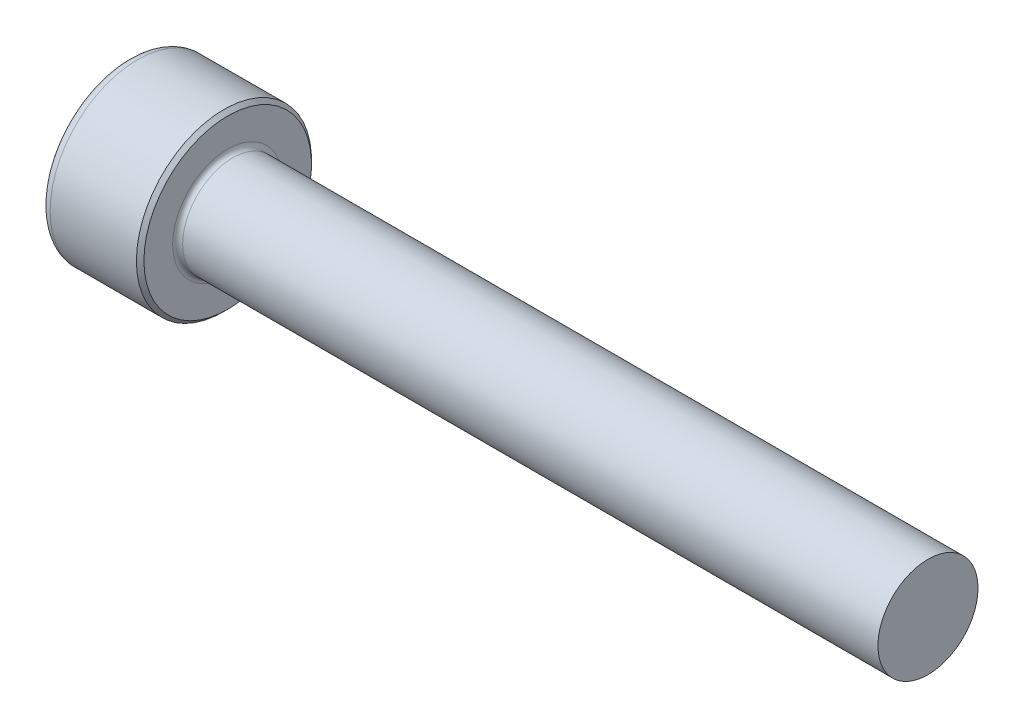
ISO-10303-21;
HEADER;
FILE_DESCRIPTION(('STEP AP214'),'2;1');
FILE_NAME('part.step','',(''),(''),'','','');
FILE_SCHEMA(('AUTOMOTIVE_DESIGN { 1 0 10303 214 1 1 1 1 }'));
ENDSEC;
DATA;
#1=APPLICATION_CONTEXT('core data for automotive mechanical design processes');
#2=APPLICATION_PROTOCOL_DEFINITION('international standard','automotive_design',2000,#1);
#3=PRODUCT_CONTEXT('',#1,'mechanical');
#4=PRODUCT('Part','Part','',(#3));
#5=PRODUCT_RELATED_PRODUCT_CATEGORY('part','',(#4));
#6=PRODUCT_DEFINITION_FORMATION('','',#4);
#7=PRODUCT_DEFINITION_CONTEXT('part definition',#1,'design');
#8=PRODUCT_DEFINITION('design','',#6,#7);
#9=PRODUCT_DEFINITION_SHAPE('','',#8);
#10=(LENGTH_UNIT() NAMED_UNIT(*) SI_UNIT(.MILLI.,.METRE.));
#11=(NAMED_UNIT(*) PLANE_ANGLE_UNIT() SI_UNIT($,.RADIAN.));
#12=(NAMED_UNIT(*) SI_UNIT($,.STERADIAN.) SOLID_ANGLE_UNIT());
#13=UNCERTAINTY_MEASURE_WITH_UNIT(LENGTH_MEASURE(1.E-05),#10,'distance_accuracy_value','');
#14=(GEOMETRIC_REPRESENTATION_CONTEXT(3) GLOBAL_UNCERTAINTY_ASSIGNED_CONTEXT((#13)) GLOBAL_UNIT_ASSIGNED_CONTEXT((#10,
#11,#12)) REPRESENTATION_CONTEXT('',''));
#15=CARTESIAN_POINT('',(0.,0.,0.));
#16=DIRECTION('',(0.,0.,1.));
#17=DIRECTION('',(1.,0.,0.));
#18=AXIS2_PLACEMENT_3D('',#15,#16,#17);
#19=CARTESIAN_POINT('',(0.,0.,0.));
#20=DIRECTION('',(-1.,0.,0.));
#21=DIRECTION('',(0.,0.,1.));
#22=AXIS2_PLACEMENT_3D('',#19,#20,#21);
#23=CYLINDRICAL_SURFACE('',#22,2.);
#24=CARTESIAN_POINT('',(4.2,0.,0.));
#25=DIRECTION('',(-1.,0.,0.));
#26=DIRECTION('',(0.,0.,1.));
#27=AXIS2_PLACEMENT_3D('',#24,#25,#26);
#28=CIRCLE('',#27,2.);
#29=CARTESIAN_POINT('',(4.2,0.,2.));
#30=VERTEX_POINT('',#29);
#31=EDGE_CURVE('E204',#30,#30,#28,.T.);
#32=ORIENTED_EDGE('',*,*,#31,.F.);
#33=EDGE_LOOP('',(#32));
#34=FACE_BOUND('',#33,.T.);
#35=CARTESIAN_POINT('',(32.,0.,0.));
#36=DIRECTION('',(1.,0.,0.));
#37=DIRECTION('',(0.,0.,-1.));
#38=AXIS2_PLACEMENT_3D('',#35,#36,#37);
#39=CIRCLE('',#38,2.);
#40=CARTESIAN_POINT('',(32.,0.,-2.));
#41=VERTEX_POINT('',#40);
#42=EDGE_CURVE('E111',#41,#41,#39,.T.);
#43=ORIENTED_EDGE('',*,*,#42,.F.);
#44=EDGE_LOOP('',(#43));
#45=FACE_BOUND('',#44,.T.);
#46=ADVANCED_FACE('F44',(#34,#45),#23,.T.);
#47=CARTESIAN_POINT('',(0.,0.,0.));
#48=DIRECTION('',(1.,0.,0.));
#49=DIRECTION('',(0.,0.,-1.));
#50=AXIS2_PLACEMENT_3D('',#47,#48,#49);
#51=PLANE('',#50);
#52=CARTESIAN_POINT('',(0.,0.,0.));
#53=DIRECTION('',(1.,0.,0.));
#54=DIRECTION('',(0.,0.,-1.));
#55=AXIS2_PLACEMENT_3D('',#52,#53,#54);
#56=CIRCLE('',#55,3.1);
#57=CARTESIAN_POINT('',(0.,0.,-3.1));
#58=VERTEX_POINT('',#57);
#59=EDGE_CURVE('E219',#58,#58,#56,.F.);
#60=ORIENTED_EDGE('',*,*,#59,.T.);
#61=EDGE_LOOP('',(#60));
#62=FACE_BOUND('',#61,.T.);
#63=CARTESIAN_POINT('',(0.,0.,0.));
#64=DIRECTION('',(-1.,0.,0.));
#65=DIRECTION('',(0.,0.,1.));
#66=AXIS2_PLACEMENT_3D('',#63,#64,#65);
#67=CIRCLE('',#66,1.72);
#68=CARTESIAN_POINT('',(0.,0.,-1.72));
#69=VERTEX_POINT('',#68);
#70=CARTESIAN_POINT('',(0.,-1.48956369450923,-0.859999999999999));
#71=VERTEX_POINT('',#70);
#72=EDGE_CURVE('E71',#69,#71,#67,.T.);
#73=ORIENTED_EDGE('',*,*,#72,.F.);
#74=CARTESIAN_POINT('',(0.,1.48956369450923,-0.86));
#75=VERTEX_POINT('',#74);
#76=EDGE_CURVE('E145',#75,#69,#67,.T.);
#77=ORIENTED_EDGE('',*,*,#76,.F.);
#78=CARTESIAN_POINT('',(0.,1.48956369450924,0.859999999999998));
#79=VERTEX_POINT('',#78);
#80=EDGE_CURVE('E140',#79,#75,#67,.T.);
#81=ORIENTED_EDGE('',*,*,#80,.F.);
#82=CARTESIAN_POINT('',(0.,0.,1.72));
#83=VERTEX_POINT('',#82);
#84=EDGE_CURVE('E113',#83,#79,#67,.T.);
#85=ORIENTED_EDGE('',*,*,#84,.F.);
#86=CARTESIAN_POINT('',(0.,-1.48956369450923,0.860000000000001));
#87=VERTEX_POINT('',#86);
#88=EDGE_CURVE('E103',#87,#83,#67,.T.);
#89=ORIENTED_EDGE('',*,*,#88,.F.);
#90=EDGE_CURVE('E64',#71,#87,#67,.T.);
#91=ORIENTED_EDGE('',*,*,#90,.F.);
#92=EDGE_LOOP('',(#73,#77,#81,#85,#89,#91));
#93=FACE_BOUND('',#92,.T.);
#94=ADVANCED_FACE('F138',(#62,#93),#51,.F.);
#95=CARTESIAN_POINT('',(0.,0.,0.));
#96=DIRECTION('',(-1.,0.,0.));
#97=DIRECTION('',(0.,0.,1.));
#98=AXIS2_PLACEMENT_3D('',#95,#96,#97);
#99=CYLINDRICAL_SURFACE('',#98,3.5);
#100=CARTESIAN_POINT('',(3.85,0.,0.));
#101=DIRECTION('',(-1.,0.,0.));
#102=DIRECTION('',(0.,0.,1.));
#103=AXIS2_PLACEMENT_3D('',#100,#101,#102);
#104=CIRCLE('',#103,3.5);
#105=CARTESIAN_POINT('',(3.85,0.,3.5));
#106=VERTEX_POINT('',#105);
#107=EDGE_CURVE('E225',#106,#106,#104,.T.);
#108=ORIENTED_EDGE('',*,*,#107,.T.);
#109=EDGE_LOOP('',(#108));
#110=FACE_BOUND('',#109,.T.);
#111=CARTESIAN_POINT('',(0.4,0.,0.));
#112=DIRECTION('',(1.,0.,0.));
#113=DIRECTION('',(0.,0.,-1.));
#114=AXIS2_PLACEMENT_3D('',#111,#112,#113);
#115=CIRCLE('',#114,3.5);
#116=CARTESIAN_POINT('',(0.4,0.,-3.5));
#117=VERTEX_POINT('',#116);
#118=EDGE_CURVE('E222',#117,#117,#115,.T.);
#119=ORIENTED_EDGE('',*,*,#118,.T.);
#120=EDGE_LOOP('',(#119));
#121=FACE_BOUND('',#120,.T.);
#122=ADVANCED_FACE('F238',(#110,#121),#99,.T.);
#123=CARTESIAN_POINT('',(4.,3.5,0.));
#124=DIRECTION('',(-1.,0.,0.));
#125=DIRECTION('',(0.,0.,1.));
#126=AXIS2_PLACEMENT_3D('',#123,#124,#125);
#127=PLANE('',#126);
#128=CARTESIAN_POINT('',(4.,0.,0.));
#129=DIRECTION('',(-1.,0.,0.));
#130=DIRECTION('',(0.,0.,1.));
#131=AXIS2_PLACEMENT_3D('',#128,#129,#130);
#132=CIRCLE('',#131,3.35);
#133=CARTESIAN_POINT('',(4.,0.,3.35));
#134=VERTEX_POINT('',#133);
#135=EDGE_CURVE('E58',#134,#134,#132,.F.);
#136=ORIENTED_EDGE('',*,*,#135,.T.);
#137=EDGE_LOOP('',(#136));
#138=FACE_BOUND('',#137,.T.);
#139=CARTESIAN_POINT('',(4.,0.,0.));
#140=DIRECTION('',(-1.,0.,0.));
#141=DIRECTION('',(0.,0.,1.));
#142=AXIS2_PLACEMENT_3D('',#139,#140,#141);
#143=CIRCLE('',#142,2.2);
#144=CARTESIAN_POINT('',(4.,0.,2.2));
#145=VERTEX_POINT('',#144);
#146=EDGE_CURVE('E216',#145,#145,#143,.T.);
#147=ORIENTED_EDGE('',*,*,#146,.T.);
#148=EDGE_LOOP('',(#147));
#149=FACE_BOUND('',#148,.T.);
#150=ADVANCED_FACE('F230',(#138,#149),#127,.F.);
#151=CARTESIAN_POINT('',(4.2,0.,0.));
#152=DIRECTION('',(-1.,0.,0.));
#153=DIRECTION('',(0.,0.,1.));
#154=AXIS2_PLACEMENT_3D('',#151,#152,#153);
#155=TOROIDAL_SURFACE('',#154,2.2,0.2);
#156=ORIENTED_EDGE('',*,*,#146,.F.);
#157=EDGE_LOOP('',(#156));
#158=FACE_BOUND('',#157,.T.);
#159=ORIENTED_EDGE('',*,*,#31,.T.);
#160=EDGE_LOOP('',(#159));
#161=FACE_BOUND('',#160,.T.);
#162=ADVANCED_FACE('F246',(#158,#161),#155,.F.);
#163=CARTESIAN_POINT('',(0.4,0.,0.));
#164=DIRECTION('',(1.,0.,0.));
#165=DIRECTION('',(0.,0.,-1.));
#166=AXIS2_PLACEMENT_3D('',#163,#164,#165);
#167=TOROIDAL_SURFACE('',#166,3.1,0.4);
#168=ORIENTED_EDGE('',*,*,#118,.F.);
#169=EDGE_LOOP('',(#168));
#170=FACE_BOUND('',#169,.T.);
#171=ORIENTED_EDGE('',*,*,#59,.F.);
#172=EDGE_LOOP('',(#171));
#173=FACE_BOUND('',#172,.T.);
#174=ADVANCED_FACE('F235',(#170,#173),#167,.T.);
#175=CARTESIAN_POINT('',(3.85,0.,0.));
#176=DIRECTION('',(-1.,0.,0.));
#177=DIRECTION('',(0.,0.,1.));
#178=AXIS2_PLACEMENT_3D('',#175,#176,#177);
#179=CONICAL_SURFACE('',#178,3.5,0.785398163397455);
#180=ORIENTED_EDGE('',*,*,#135,.F.);
#181=EDGE_LOOP('',(#180));
#182=FACE_BOUND('',#181,.T.);
#183=ORIENTED_EDGE('',*,*,#107,.F.);
#184=EDGE_LOOP('',(#183));
#185=FACE_BOUND('',#184,.T.);
#186=ADVANCED_FACE('F46',(#182,#185),#179,.T.);
#187=CARTESIAN_POINT('',(0.,0.,0.));
#188=DIRECTION('',(-1.,0.,0.));
#189=DIRECTION('',(0.,0.,1.));
#190=AXIS2_PLACEMENT_3D('',#187,#188,#189);
#191=CONICAL_SURFACE('',#190,1.72,1.0471975511966);
#192=ORIENTED_EDGE('',*,*,#84,.T.);
#193=CARTESIAN_POINT('',(-6.66733795908039E-05,-0.000199999999999748,1.72011547005384));
#194=CARTESIAN_POINT('',(0.0217642282774095,0.0652606786833884,1.68232172959465));
#195=CARTESIAN_POINT('',(0.0416191270638703,0.131286405547804,1.64420175841604));
#196=CARTESIAN_POINT('',(0.0762771760190284,0.264481325669599,1.56730163542903));
#197=CARTESIAN_POINT('',(0.0910680635017844,0.331652886810751,1.5285201165223));
#198=CARTESIAN_POINT('',(0.114093772405454,0.465163484222722,1.45143773716683));
#199=CARTESIAN_POINT('',(0.122481816019068,0.531481970186887,1.41314874144317));
#200=CARTESIAN_POINT('',(0.132498056760639,0.664431226407797,1.33639045257547));
#201=CARTESIAN_POINT('',(0.13413454538366,0.731061512956971,1.29792143870012));
#202=CARTESIAN_POINT('',(0.130742415424505,0.855579416187288,1.22603099375117));
#203=CARTESIAN_POINT('',(0.126546683530354,0.913485608573299,1.19259883798936));
#204=CARTESIAN_POINT('',(0.113244842751698,1.02892070857717,1.12595235192819));
#205=CARTESIAN_POINT('',(0.104134183519144,1.08644921649049,1.09273825239836));
#206=CARTESIAN_POINT('',(0.0813567321989698,1.20212260425817,1.02595419083261));
#207=CARTESIAN_POINT('',(0.0675933218337276,1.26025283284703,0.992392687708781));
#208=CARTESIAN_POINT('',(0.036355214015323,1.37564595205978,0.925770439268665));
#209=CARTESIAN_POINT('',(0.0188878634218886,1.43291032272483,0.892708839450225));
#210=CARTESIAN_POINT('',(-6.66733795909694E-05,1.48976369450923,0.859884529946161));
#211=B_SPLINE_CURVE_WITH_KNOTS('',3,(#193,#194,#195,#196,#197,#198,#199,#200,#201,#202,#203,
#204,#205,#206,#207,#208,#209,#210),.UNSPECIFIED.,.F.,.F.,(4,2,2,2,2,2,2,2,4),(0.,
0.236123584216744,0.472814971763925,0.70364743867324,0.934196338755068,1.13499258844024,
1.33597505955949,1.54141751288895,1.74645621521931),.UNSPECIFIED.);
#212=EDGE_CURVE('E11',#83,#79,#211,.T.);
#213=ORIENTED_EDGE('',*,*,#212,.F.);
#214=EDGE_LOOP('',(#192,#213));
#215=FACE_BOUND('',#214,.T.);
#216=ADVANCED_FACE('F116',(#215),#191,.F.);
#217=ORIENTED_EDGE('',*,*,#80,.T.);
#218=CARTESIAN_POINT('',(-0.553872346443666,1.48956369450923,-2.22711389091029));
#219=CARTESIAN_POINT('',(-0.523011837033895,1.48956369450923,-2.16278931232635));
#220=CARTESIAN_POINT('',(-0.492471948370039,1.48956369450923,-2.09830816259722));
#221=CARTESIAN_POINT('',(-0.432215091527907,1.48956369450923,-1.9689489379535));
#222=CARTESIAN_POINT('',(-0.402498271447276,1.48956369450923,-1.90407079413769));
#223=CARTESIAN_POINT('',(-0.343903216609206,1.48956369450923,-1.77346180510982));
#224=CARTESIAN_POINT('',(-0.315031162223555,1.48956369450923,-1.70772817468804));
#225=CARTESIAN_POINT('',(-0.258582383686243,1.48956369450923,-1.57571038900732));
#226=CARTESIAN_POINT('',(-0.231005592183019,1.48956369450923,-1.50942626258466));
#227=CARTESIAN_POINT('',(-0.176786917007244,1.48956369450923,-1.3744512033089));
#228=CARTESIAN_POINT('',(-0.150188317148423,1.48956369450923,-1.30574264939369));
#229=CARTESIAN_POINT('',(-0.0992114690057399,1.48956369450923,-1.16750939875529));
#230=CARTESIAN_POINT('',(-0.0748334989467716,1.48956369450923,-1.09798460099264));
#231=CARTESIAN_POINT('',(-0.00605863684124883,1.48956369450923,-0.888298955989035));
#232=CARTESIAN_POINT('',(0.0341405436403476,1.48956369450923,-0.746643132602322));
#233=CARTESIAN_POINT('',(0.0807696169748476,1.48956369450923,-0.53132508624346));
#234=CARTESIAN_POINT('',(0.0940283380684503,1.48956369450923,-0.459148714174868));
#235=CARTESIAN_POINT('',(0.115080292133262,1.48956369450923,-0.313984049201615));
#236=CARTESIAN_POINT('',(0.122873894447601,1.48956369450923,-0.240995811503114));
#237=CARTESIAN_POINT('',(0.132274708645124,1.48956369450923,-0.0954899068624098));
#238=CARTESIAN_POINT('',(0.133954924318342,1.48956369450923,-0.0229770797808425));
#239=CARTESIAN_POINT('',(0.131181479901192,1.48956369450923,0.121928811443861));
#240=CARTESIAN_POINT('',(0.126727439999776,1.48956369450923,0.194321867893361));
#241=CARTESIAN_POINT('',(0.108561751909046,1.48956369450923,0.372940988811292));
#242=CARTESIAN_POINT('',(0.0914458065162157,1.48956369450923,0.478820912483157));
#243=CARTESIAN_POINT('',(0.0473087219071334,1.48956369450923,0.688521798528872));
#244=CARTESIAN_POINT('',(0.0202756445557509,1.48956369450923,0.792340119725078));
#245=CARTESIAN_POINT('',(-0.0259034576124392,1.48956369450923,0.947611834599062));
#246=CARTESIAN_POINT('',(-0.0424501168235348,1.48956369450923,0.999867846476749));
#247=CARTESIAN_POINT('',(-0.0770740959832751,1.48956369450923,1.10383591910144));
#248=CARTESIAN_POINT('',(-0.0951504606814051,1.48956369450923,1.15554829697397));
#249=CARTESIAN_POINT('',(-0.132571328832377,1.48956369450923,1.25849820783797));
#250=CARTESIAN_POINT('',(-0.151915601820562,1.48956369450923,1.30973582520364));
#251=CARTESIAN_POINT('',(-0.19166304719895,1.48956369450923,1.41180732496668));
#252=CARTESIAN_POINT('',(-0.212066398494351,1.48956369450923,1.4626411374679));
#253=CARTESIAN_POINT('',(-0.2654538227121,1.48956369450923,1.59239661672335));
#254=CARTESIAN_POINT('',(-0.299067808063192,1.48956369450923,1.67105883093363));
#255=CARTESIAN_POINT('',(-0.367916168462612,1.48956369450923,1.82767291113502));
#256=CARTESIAN_POINT('',(-0.40315066490114,1.48956369450923,1.90562472338518));
#257=CARTESIAN_POINT('',(-0.510713671985838,1.48956369450923,2.13865126138998));
#258=CARTESIAN_POINT('',(-0.58489067304516,1.48956369450923,2.29287105920052));
#259=CARTESIAN_POINT('',(-0.736355645902029,1.48956369450923,2.59999310452797));
#260=CARTESIAN_POINT('',(-0.813647330043132,1.48956369450923,2.75289349925603));
#261=CARTESIAN_POINT('',(-0.970218116126181,1.48956369450923,3.05764670176514));
#262=CARTESIAN_POINT('',(-1.04949696544783,1.48956369450923,3.20949963960666));
#263=CARTESIAN_POINT('',(-1.20187620850843,1.48956369450923,3.49818182293789));
#264=CARTESIAN_POINT('',(-1.27485348885754,1.48956369450923,3.63507627939256));
#265=CARTESIAN_POINT('',(-1.42163955006499,1.48956369450923,3.90842484363491));
#266=CARTESIAN_POINT('',(-1.49544836169502,1.48956369450923,4.04487893488443));
#267=CARTESIAN_POINT('',(-1.64350043270313,1.48956369450923,4.31710120670082));
#268=CARTESIAN_POINT('',(-1.71774210954172,1.48956369450923,4.45287024910623));
#269=CARTESIAN_POINT('',(-1.86670866816565,1.48956369450923,4.72413384179882));
#270=CARTESIAN_POINT('',(-1.94143352446038,1.48956369450923,4.859628406079));
#271=CARTESIAN_POINT('',(-2.01633556372022,1.48956369450923,4.99502435662038));
#272=B_SPLINE_CURVE_WITH_KNOTS('',3,(#218,#219,#220,#221,#222,#223,#224,#225,#226,#227,#228,
#229,#230,#231,#232,#233,#234,#235,#236,#237,#238,#239,#240,#241,#242,#243,#244,#245,#246,#247,
#248,#249,#250,#251,#252,#253,#254,#255,#256,#257,#258,#259,#260,#261,#262,#263,#264,#265,#266,
#267,#268,#269,#270,#271),.UNSPECIFIED.,.F.,.F.,(4,2,2,2,2,2,2,2,2,2,2,2,2,2,2,2,2,2,2,2,2,2,2,
2,2,2,4),(0.,0.214035915324585,0.42811009593794,0.643482858123198,0.858844408848936,
1.07983570193016,1.30085464525366,1.74164571189172,1.96163091074717,2.18160124115092,
2.39893598332408,2.616284182688,2.93738740460952,3.25887844232104,3.42329982069595,
3.58761927050191,3.75190893474301,3.91622644257169,4.17282966742024,4.42945214546131,
4.94278186207688,5.45674263628285,5.97063840082624,6.43602958417558,6.90143804676353,
7.36566272943532,7.82986311811128),.UNSPECIFIED.);
#273=EDGE_CURVE('E141',#79,#75,#272,.F.);
#274=ORIENTED_EDGE('',*,*,#273,.F.);
#275=EDGE_LOOP('',(#217,#274));
#276=FACE_BOUND('',#275,.T.);
#277=ADVANCED_FACE('F334',(#276),#191,.F.);
#278=ORIENTED_EDGE('',*,*,#76,.T.);
#279=CARTESIAN_POINT('',(-6.66733795911306E-05,1.48976369450923,-0.859884529946162));
#280=CARTESIAN_POINT('',(0.0217642282774093,1.42430301582585,-0.897678270405352));
#281=CARTESIAN_POINT('',(0.04161912706387,1.35827728896143,-0.935798241583963));
#282=CARTESIAN_POINT('',(0.0762771760190281,1.22508236883964,-1.01269836457097));
#283=CARTESIAN_POINT('',(0.091068063501784,1.15791080769848,-1.0514798834777));
#284=CARTESIAN_POINT('',(0.114093772405453,1.02440021028651,-1.12856226283317));
#285=CARTESIAN_POINT('',(0.122481816019067,0.958081724322348,-1.16685125855683));
#286=CARTESIAN_POINT('',(0.132498056760639,0.825132468101438,-1.24360954742453));
#287=CARTESIAN_POINT('',(0.13413454538366,0.758502181552264,-1.28207856129988));
#288=CARTESIAN_POINT('',(0.130742415424505,0.633984278321946,-1.35396900624883));
#289=CARTESIAN_POINT('',(0.126546683530353,0.576078085935935,-1.38740116201064));
#290=CARTESIAN_POINT('',(0.113244842751698,0.460642985932064,-1.45404764807181));
#291=CARTESIAN_POINT('',(0.104134183519144,0.403114478018743,-1.48726174760164));
#292=CARTESIAN_POINT('',(0.0813567321989697,0.287441090251069,-1.55404580916739));
#293=CARTESIAN_POINT('',(0.0675933218337274,0.229310861662209,-1.58760731229122));
#294=CARTESIAN_POINT('',(0.0363552140153228,0.113917742449452,-1.65422956073133));
#295=CARTESIAN_POINT('',(0.0188878634218884,0.0566533717844031,-1.68729116054977));
#296=CARTESIAN_POINT('',(-6.66733795909699E-05,-0.000200000000000195,-1.72011547005384));
#297=B_SPLINE_CURVE_WITH_KNOTS('',3,(#279,#280,#281,#282,#283,#284,#285,#286,#287,#288,#289,
#290,#291,#292,#293,#294,#295,#296),.UNSPECIFIED.,.F.,.F.,(4,2,2,2,2,2,2,2,4),(0.,
0.236123584216744,0.472814971763925,0.70364743867324,0.934196338755068,1.13499258844024,
1.33597505955949,1.54141751288895,1.74645621521931),.UNSPECIFIED.);
#298=EDGE_CURVE('E143',#75,#69,#297,.T.);
#299=ORIENTED_EDGE('',*,*,#298,.F.);
#300=EDGE_LOOP('',(#278,#299));
#301=FACE_BOUND('',#300,.T.);
#302=ADVANCED_FACE('F328',(#301),#191,.F.);
#303=ORIENTED_EDGE('',*,*,#72,.T.);
#304=CARTESIAN_POINT('',(-6.66733795910543E-05,0.000199999999999748,-1.72011547005384));
#305=CARTESIAN_POINT('',(0.0217642282774094,-0.0652606786833883,-1.68232172959465));
#306=CARTESIAN_POINT('',(0.0416191270638701,-0.131286405547804,-1.64420175841604));
#307=CARTESIAN_POINT('',(0.0762771760190282,-0.264481325669599,-1.56730163542903));
#308=CARTESIAN_POINT('',(0.091068063501784,-0.331652886810752,-1.5285201165223));
#309=CARTESIAN_POINT('',(0.114093772405453,-0.465163484222722,-1.45143773716683));
#310=CARTESIAN_POINT('',(0.122481816019067,-0.531481970186887,-1.41314874144317));
#311=CARTESIAN_POINT('',(0.132498056760639,-0.664431226407797,-1.33639045257547));
#312=CARTESIAN_POINT('',(0.13413454538366,-0.731061512956971,-1.29792143870012));
#313=CARTESIAN_POINT('',(0.130742415424505,-0.855579416187288,-1.22603099375117));
#314=CARTESIAN_POINT('',(0.126546683530353,-0.9134856085733,-1.19259883798936));
#315=CARTESIAN_POINT('',(0.113244842751698,-1.02892070857717,-1.12595235192819));
#316=CARTESIAN_POINT('',(0.104134183519143,-1.08644921649049,-1.09273825239836));
#317=CARTESIAN_POINT('',(0.0813567321989696,-1.20212260425817,-1.02595419083261));
#318=CARTESIAN_POINT('',(0.0675933218337274,-1.26025283284703,-0.992392687708781));
#319=CARTESIAN_POINT('',(0.0363552140153229,-1.37564595205978,-0.925770439268665));
#320=CARTESIAN_POINT('',(0.0188878634218885,-1.43291032272483,-0.892708839450225));
#321=CARTESIAN_POINT('',(-6.66733795909698E-05,-1.48976369450923,-0.859884529946162));
#322=B_SPLINE_CURVE_WITH_KNOTS('',3,(#304,#305,#306,#307,#308,#309,#310,#311,#312,#313,#314,
#315,#316,#317,#318,#319,#320,#321),.UNSPECIFIED.,.F.,.F.,(4,2,2,2,2,2,2,2,4),(0.,
0.236123584216745,0.472814971763925,0.70364743867324,0.934196338755068,1.13499258844024,
1.33597505955949,1.54141751288895,1.74645621521931),.UNSPECIFIED.);
#323=EDGE_CURVE('E432',#69,#71,#322,.T.);
#324=ORIENTED_EDGE('',*,*,#323,.F.);
#325=EDGE_LOOP('',(#303,#324));
#326=FACE_BOUND('',#325,.T.);
#327=ADVANCED_FACE('F322',(#326),#191,.F.);
#328=ORIENTED_EDGE('',*,*,#90,.T.);
#329=CARTESIAN_POINT('',(-0.553872346443666,-1.48956369450923,-2.22711389091029));
#330=CARTESIAN_POINT('',(-0.523011837033895,-1.48956369450923,-2.16278931232635));
#331=CARTESIAN_POINT('',(-0.492471948370039,-1.48956369450923,-2.09830816259722));
#332=CARTESIAN_POINT('',(-0.432215091527907,-1.48956369450923,-1.9689489379535));
#333=CARTESIAN_POINT('',(-0.402498271447276,-1.48956369450923,-1.90407079413769));
#334=CARTESIAN_POINT('',(-0.343903216609206,-1.48956369450923,-1.77346180510982));
#335=CARTESIAN_POINT('',(-0.315031162223556,-1.48956369450923,-1.70772817468804));
#336=CARTESIAN_POINT('',(-0.258582383686243,-1.48956369450923,-1.57571038900732));
#337=CARTESIAN_POINT('',(-0.231005592183019,-1.48956369450923,-1.50942626258466));
#338=CARTESIAN_POINT('',(-0.176786917007244,-1.48956369450923,-1.3744512033089));
#339=CARTESIAN_POINT('',(-0.150188317148423,-1.48956369450923,-1.30574264939369));
#340=CARTESIAN_POINT('',(-0.0992114690057397,-1.48956369450923,-1.16750939875529));
#341=CARTESIAN_POINT('',(-0.0748334989467714,-1.48956369450923,-1.09798460099264));
#342=CARTESIAN_POINT('',(-0.00605863684124866,-1.48956369450923,-0.888298955989035));
#343=CARTESIAN_POINT('',(0.0341405436403478,-1.48956369450923,-0.746643132602322));
#344=CARTESIAN_POINT('',(0.0807696169748478,-1.48956369450923,-0.53132508624346));
#345=CARTESIAN_POINT('',(0.0940283380684506,-1.48956369450923,-0.459148714174868));
#346=CARTESIAN_POINT('',(0.115080292133262,-1.48956369450923,-0.313984049201615));
#347=CARTESIAN_POINT('',(0.122873894447601,-1.48956369450923,-0.240995811503114));
#348=CARTESIAN_POINT('',(0.132274708645124,-1.48956369450923,-0.0954899068624102));
#349=CARTESIAN_POINT('',(0.133954924318342,-1.48956369450923,-0.022977079780843));
#350=CARTESIAN_POINT('',(0.131181479901192,-1.48956369450923,0.121928811443861));
#351=CARTESIAN_POINT('',(0.126727439999776,-1.48956369450923,0.19432186789336));
#352=CARTESIAN_POINT('',(0.108561751909046,-1.48956369450923,0.372940988811292));
#353=CARTESIAN_POINT('',(0.0914458065162159,-1.48956369450923,0.478820912483157));
#354=CARTESIAN_POINT('',(0.0473087219071336,-1.48956369450923,0.688521798528872));
#355=CARTESIAN_POINT('',(0.0202756445557511,-1.48956369450923,0.792340119725078));
#356=CARTESIAN_POINT('',(-0.025903457612439,-1.48956369450923,0.947611834599061));
#357=CARTESIAN_POINT('',(-0.0424501168235344,-1.48956369450923,0.999867846476749));
#358=CARTESIAN_POINT('',(-0.0770740959832747,-1.48956369450923,1.10383591910144));
#359=CARTESIAN_POINT('',(-0.0951504606814048,-1.48956369450923,1.15554829697397));
#360=CARTESIAN_POINT('',(-0.132571328832376,-1.48956369450923,1.25849820783797));
#361=CARTESIAN_POINT('',(-0.151915601820561,-1.48956369450923,1.30973582520364));
#362=CARTESIAN_POINT('',(-0.19166304719895,-1.48956369450923,1.41180732496668));
#363=CARTESIAN_POINT('',(-0.21206639849435,-1.48956369450923,1.4626411374679));
#364=CARTESIAN_POINT('',(-0.2654538227121,-1.48956369450923,1.59239661672335));
#365=CARTESIAN_POINT('',(-0.299067808063191,-1.48956369450923,1.67105883093363));
#366=CARTESIAN_POINT('',(-0.367916168462612,-1.48956369450923,1.82767291113502));
#367=CARTESIAN_POINT('',(-0.40315066490114,-1.48956369450923,1.90562472338518));
#368=CARTESIAN_POINT('',(-0.510713671985838,-1.48956369450923,2.13865126138998));
#369=CARTESIAN_POINT('',(-0.58489067304516,-1.48956369450923,2.29287105920052));
#370=CARTESIAN_POINT('',(-0.736355645902029,-1.48956369450923,2.59999310452797));
#371=CARTESIAN_POINT('',(-0.813647330043132,-1.48956369450923,2.75289349925603));
#372=CARTESIAN_POINT('',(-0.970218116126181,-1.48956369450923,3.05764670176514));
#373=CARTESIAN_POINT('',(-1.04949696544783,-1.48956369450923,3.20949963960667));
#374=CARTESIAN_POINT('',(-1.20187620850843,-1.48956369450923,3.49818182293789));
#375=CARTESIAN_POINT('',(-1.27485348885754,-1.48956369450923,3.63507627939256));
#376=CARTESIAN_POINT('',(-1.42163955006499,-1.48956369450923,3.90842484363491));
#377=CARTESIAN_POINT('',(-1.49544836169502,-1.48956369450923,4.04487893488443));
#378=CARTESIAN_POINT('',(-1.64350043270313,-1.48956369450923,4.31710120670082));
#379=CARTESIAN_POINT('',(-1.71774210954172,-1.48956369450923,4.45287024910623));
#380=CARTESIAN_POINT('',(-1.86670866816565,-1.48956369450923,4.72413384179882));
#381=CARTESIAN_POINT('',(-1.94143352446038,-1.48956369450923,4.85962840607901));
#382=CARTESIAN_POINT('',(-2.01633556372022,-1.48956369450923,4.99502435662038));
#383=B_SPLINE_CURVE_WITH_KNOTS('',3,(#329,#330,#331,#332,#333,#334,#335,#336,#337,#338,#339,
#340,#341,#342,#343,#344,#345,#346,#347,#348,#349,#350,#351,#352,#353,#354,#355,#356,#357,#358,
#359,#360,#361,#362,#363,#364,#365,#366,#367,#368,#369,#370,#371,#372,#373,#374,#375,#376,#377,
#378,#379,#380,#381,#382),.UNSPECIFIED.,.F.,.F.,(4,2,2,2,2,2,2,2,2,2,2,2,2,2,2,2,2,2,2,2,2,2,2,
2,2,2,4),(0.,0.214035915324585,0.428110095937941,0.643482858123199,0.858844408848936,
1.07983570193016,1.30085464525366,1.74164571189172,1.96163091074717,2.18160124115093,
2.39893598332408,2.61628418268801,2.93738740460952,3.25887844232104,3.42329982069595,
3.58761927050191,3.75190893474301,3.91622644257169,4.17282966742024,4.42945214546131,
4.94278186207688,5.45674263628285,5.97063840082624,6.43602958417558,6.90143804676353,
7.36566272943532,7.82986311811128),.UNSPECIFIED.);
#384=EDGE_CURVE('E128',#71,#87,#383,.T.);
#385=ORIENTED_EDGE('',*,*,#384,.F.);
#386=EDGE_LOOP('',(#328,#385));
#387=FACE_BOUND('',#386,.T.);
#388=ADVANCED_FACE('F316',(#387),#191,.F.);
#389=ORIENTED_EDGE('',*,*,#88,.T.);
#390=CARTESIAN_POINT('',(-6.66733795911314E-05,-1.48976369450923,0.859884529946162));
#391=CARTESIAN_POINT('',(0.0217642282774094,-1.42430301582585,0.897678270405352));
#392=CARTESIAN_POINT('',(0.0416191270638701,-1.35827728896143,0.935798241583963));
#393=CARTESIAN_POINT('',(0.0762771760190282,-1.22508236883964,1.01269836457097));
#394=CARTESIAN_POINT('',(0.0910680635017841,-1.15791080769848,1.0514798834777));
#395=CARTESIAN_POINT('',(0.114093772405453,-1.02440021028651,1.12856226283317));
#396=CARTESIAN_POINT('',(0.122481816019068,-0.958081724322347,1.16685125855683));
#397=CARTESIAN_POINT('',(0.132498056760639,-0.825132468101437,1.24360954742453));
#398=CARTESIAN_POINT('',(0.13413454538366,-0.758502181552264,1.28207856129988));
#399=CARTESIAN_POINT('',(0.130742415424505,-0.633984278321946,1.35396900624883));
#400=CARTESIAN_POINT('',(0.126546683530354,-0.576078085935935,1.38740116201064));
#401=CARTESIAN_POINT('',(0.113244842751698,-0.460642985932064,1.45404764807181));
#402=CARTESIAN_POINT('',(0.104134183519144,-0.403114478018743,1.48726174760164));
#403=CARTESIAN_POINT('',(0.08135673219897,-0.287441090251069,1.55404580916739));
#404=CARTESIAN_POINT('',(0.0675933218337278,-0.229310861662209,1.58760731229122));
#405=CARTESIAN_POINT('',(0.0363552140153232,-0.113917742449452,1.65422956073133));
#406=CARTESIAN_POINT('',(0.0188878634218888,-0.0566533717844031,1.68729116054977));
#407=CARTESIAN_POINT('',(-6.66733795907192E-05,0.000200000000000253,1.72011547005384));
#408=B_SPLINE_CURVE_WITH_KNOTS('',3,(#390,#391,#392,#393,#394,#395,#396,#397,#398,#399,#400,
#401,#402,#403,#404,#405,#406,#407),.UNSPECIFIED.,.F.,.F.,(4,2,2,2,2,2,2,2,4),(0.,
0.236123584216744,0.472814971763925,0.703647438673239,0.934196338755068,1.13499258844024,
1.33597505955949,1.54141751288895,1.74645621521931),.UNSPECIFIED.);
#409=EDGE_CURVE('E107',#87,#83,#408,.T.);
#410=ORIENTED_EDGE('',*,*,#409,.F.);
#411=EDGE_LOOP('',(#389,#410));
#412=FACE_BOUND('',#411,.T.);
#413=ADVANCED_FACE('F105',(#412),#191,.F.);
#414=CARTESIAN_POINT('',(2.,1.48956369450923,2.58));
#415=DIRECTION('',(-1.,0.,0.));
#416=DIRECTION('',(0.,0.,1.));
#417=AXIS2_PLACEMENT_3D('',#414,#415,#416);
#418=PLANE('',#417);
#419=DIRECTION('',(0.,0.866025403784439,0.5));
#420=VECTOR('',#419,1.);
#421=CARTESIAN_POINT('',(2.,-1.48956369450923,0.86));
#422=LINE('',#421,#420);
#423=CARTESIAN_POINT('',(2.,-1.48956369450923,0.86));
#424=VERTEX_POINT('',#423);
#425=CARTESIAN_POINT('',(2.,0.,1.72));
#426=VERTEX_POINT('',#425);
#427=EDGE_CURVE('E127',#424,#426,#422,.T.);
#428=ORIENTED_EDGE('',*,*,#427,.T.);
#429=DIRECTION('',(0.,0.866025403784438,-0.5));
#430=VECTOR('',#429,1.);
#431=CARTESIAN_POINT('',(2.,0.,1.72));
#432=LINE('',#431,#430);
#433=CARTESIAN_POINT('',(2.,1.48956369450923,0.859999999999999));
#434=VERTEX_POINT('',#433);
#435=EDGE_CURVE('E132',#426,#434,#432,.T.);
#436=ORIENTED_EDGE('',*,*,#435,.T.);
#437=DIRECTION('',(0.,0.,-1.));
#438=VECTOR('',#437,1.);
#439=CARTESIAN_POINT('',(2.,1.48956369450923,0.859999999999999));
#440=LINE('',#439,#438);
#441=CARTESIAN_POINT('',(2.,1.48956369450923,-0.86));
#442=VERTEX_POINT('',#441);
#443=EDGE_CURVE('E192',#434,#442,#440,.T.);
#444=ORIENTED_EDGE('',*,*,#443,.T.);
#445=DIRECTION('',(0.,-0.866025403784439,-0.5));
#446=VECTOR('',#445,1.);
#447=CARTESIAN_POINT('',(2.,1.48956369450923,-0.86));
#448=LINE('',#447,#446);
#449=CARTESIAN_POINT('',(2.,0.,-1.72));
#450=VERTEX_POINT('',#449);
#451=EDGE_CURVE('E195',#442,#450,#448,.T.);
#452=ORIENTED_EDGE('',*,*,#451,.T.);
#453=DIRECTION('',(0.,-0.866025403784438,0.5));
#454=VECTOR('',#453,1.);
#455=CARTESIAN_POINT('',(2.,0.,-1.72));
#456=LINE('',#455,#454);
#457=CARTESIAN_POINT('',(2.,-1.48956369450923,-0.86));
#458=VERTEX_POINT('',#457);
#459=EDGE_CURVE('E198',#450,#458,#456,.T.);
#460=ORIENTED_EDGE('',*,*,#459,.T.);
#461=DIRECTION('',(0.,0.,1.));
#462=VECTOR('',#461,1.);
#463=CARTESIAN_POINT('',(2.,-1.48956369450923,-0.86));
#464=LINE('',#463,#462);
#465=EDGE_CURVE('E135',#458,#424,#464,.T.);
#466=ORIENTED_EDGE('',*,*,#465,.T.);
#467=EDGE_LOOP('',(#428,#436,#444,#452,#460,#466));
#468=FACE_BOUND('',#467,.T.);
#469=ADVANCED_FACE('F172',(#468),#418,.T.);
#470=CARTESIAN_POINT('',(2.,0.,1.72));
#471=DIRECTION('',(0.,0.5,0.866025403784439));
#472=DIRECTION('',(0.,-0.866025403784438,0.5));
#473=AXIS2_PLACEMENT_3D('',#470,#471,#472);
#474=PLANE('',#473);
#475=DIRECTION('',(-1.,0.,0.));
#476=VECTOR('',#475,1.);
#477=CARTESIAN_POINT('',(2.,0.,1.72));
#478=LINE('',#477,#476);
#479=EDGE_CURVE('E124',#426,#83,#478,.T.);
#480=ORIENTED_EDGE('',*,*,#479,.T.);
#481=ORIENTED_EDGE('',*,*,#212,.T.);
#482=DIRECTION('',(-1.,0.,0.));
#483=VECTOR('',#482,1.);
#484=CARTESIAN_POINT('',(2.,1.48956369450923,0.859999999999999));
#485=LINE('',#484,#483);
#486=EDGE_CURVE('E134',#434,#79,#485,.T.);
#487=ORIENTED_EDGE('',*,*,#486,.F.);
#488=ORIENTED_EDGE('',*,*,#435,.F.);
#489=EDGE_LOOP('',(#480,#481,#487,#488));
#490=FACE_BOUND('',#489,.T.);
#491=ADVANCED_FACE('F130',(#490),#474,.F.);
#492=CARTESIAN_POINT('',(2.,1.48956369450923,0.859999999999999));
#493=DIRECTION('',(0.,1.,0.));
#494=DIRECTION('',(0.,0.,1.));
#495=AXIS2_PLACEMENT_3D('',#492,#493,#494);
#496=PLANE('',#495);
#497=ORIENTED_EDGE('',*,*,#486,.T.);
#498=ORIENTED_EDGE('',*,*,#273,.T.);
#499=DIRECTION('',(-1.,0.,0.));
#500=VECTOR('',#499,1.);
#501=CARTESIAN_POINT('',(2.,1.48956369450923,-0.86));
#502=LINE('',#501,#500);
#503=EDGE_CURVE('E210',#442,#75,#502,.T.);
#504=ORIENTED_EDGE('',*,*,#503,.F.);
#505=ORIENTED_EDGE('',*,*,#443,.F.);
#506=EDGE_LOOP('',(#497,#498,#504,#505));
#507=FACE_BOUND('',#506,.T.);
#508=ADVANCED_FACE('F162',(#507),#496,.F.);
#509=CARTESIAN_POINT('',(2.,1.48956369450923,-0.86));
#510=DIRECTION('',(0.,0.5,-0.866025403784439));
#511=DIRECTION('',(0.,0.866025403784439,0.5));
#512=AXIS2_PLACEMENT_3D('',#509,#510,#511);
#513=PLANE('',#512);
#514=ORIENTED_EDGE('',*,*,#503,.T.);
#515=ORIENTED_EDGE('',*,*,#298,.T.);
#516=DIRECTION('',(-1.,0.,0.));
#517=VECTOR('',#516,1.);
#518=CARTESIAN_POINT('',(2.,0.,-1.72));
#519=LINE('',#518,#517);
#520=EDGE_CURVE('E208',#450,#69,#519,.T.);
#521=ORIENTED_EDGE('',*,*,#520,.F.);
#522=ORIENTED_EDGE('',*,*,#451,.F.);
#523=EDGE_LOOP('',(#514,#515,#521,#522));
#524=FACE_BOUND('',#523,.T.);
#525=ADVANCED_FACE('F165',(#524),#513,.F.);
#526=CARTESIAN_POINT('',(2.,0.,-1.72));
#527=DIRECTION('',(0.,-0.5,-0.866025403784439));
#528=DIRECTION('',(0.,0.866025403784438,-0.5));
#529=AXIS2_PLACEMENT_3D('',#526,#527,#528);
#530=PLANE('',#529);
#531=ORIENTED_EDGE('',*,*,#520,.T.);
#532=ORIENTED_EDGE('',*,*,#323,.T.);
#533=DIRECTION('',(-1.,0.,0.));
#534=VECTOR('',#533,1.);
#535=CARTESIAN_POINT('',(2.,-1.48956369450923,-0.86));
#536=LINE('',#535,#534);
#537=EDGE_CURVE('E205',#458,#71,#536,.T.);
#538=ORIENTED_EDGE('',*,*,#537,.F.);
#539=ORIENTED_EDGE('',*,*,#459,.F.);
#540=EDGE_LOOP('',(#531,#532,#538,#539));
#541=FACE_BOUND('',#540,.T.);
#542=ADVANCED_FACE('F282',(#541),#530,.F.);
#543=CARTESIAN_POINT('',(2.,-1.48956369450923,-0.86));
#544=DIRECTION('',(0.,-1.,0.));
#545=DIRECTION('',(0.,0.,-1.));
#546=AXIS2_PLACEMENT_3D('',#543,#544,#545);
#547=PLANE('',#546);
#548=ORIENTED_EDGE('',*,*,#537,.T.);
#549=ORIENTED_EDGE('',*,*,#384,.T.);
#550=DIRECTION('',(-1.,0.,0.));
#551=VECTOR('',#550,1.);
#552=CARTESIAN_POINT('',(2.,-1.48956369450923,0.86));
#553=LINE('',#552,#551);
#554=EDGE_CURVE('E126',#424,#87,#553,.T.);
#555=ORIENTED_EDGE('',*,*,#554,.F.);
#556=ORIENTED_EDGE('',*,*,#465,.F.);
#557=EDGE_LOOP('',(#548,#549,#555,#556));
#558=FACE_BOUND('',#557,.T.);
#559=ADVANCED_FACE('F177',(#558),#547,.F.);
#560=CARTESIAN_POINT('',(2.,-1.48956369450923,0.86));
#561=DIRECTION('',(0.,-0.5,0.866025403784439));
#562=DIRECTION('',(0.,-0.866025403784439,-0.5));
#563=AXIS2_PLACEMENT_3D('',#560,#561,#562);
#564=PLANE('',#563);
#565=ORIENTED_EDGE('',*,*,#554,.T.);
#566=ORIENTED_EDGE('',*,*,#409,.T.);
#567=ORIENTED_EDGE('',*,*,#479,.F.);
#568=ORIENTED_EDGE('',*,*,#427,.F.);
#569=EDGE_LOOP('',(#565,#566,#567,#568));
#570=FACE_BOUND('',#569,.T.);
#571=ADVANCED_FACE('F122',(#570),#564,.F.);
#572=CARTESIAN_POINT('',(32.,0.,0.));
#573=DIRECTION('',(1.,0.,0.));
#574=DIRECTION('',(0.,0.,-1.));
#575=AXIS2_PLACEMENT_3D('',#572,#573,#574);
#576=PLANE('',#575);
#577=ORIENTED_EDGE('',*,*,#42,.T.);
#578=EDGE_LOOP('',(#577));
#579=FACE_BOUND('',#578,.T.);
#580=ADVANCED_FACE('F176',(#579),#576,.T.);
#581=CLOSED_SHELL('',(#46,#94,#122,#150,#162,#174,#186,#216,#277,#302,#327,#388,#413,#469,#491,
#508,#525,#542,#559,#571,#580));
#582=MANIFOLD_SOLID_BREP('B2',#581);
#583=ADVANCED_BREP_SHAPE_REPRESENTATION('',(#18,#582),#14);
#584=SHAPE_DEFINITION_REPRESENTATION(#9,#583);
ENDSEC;
END-ISO-10303-21;
